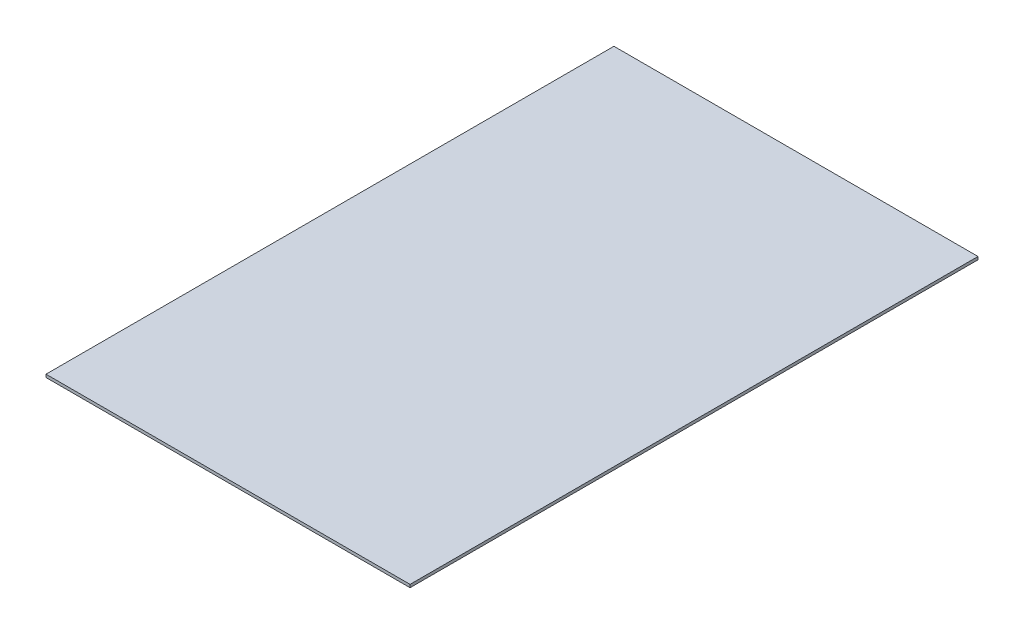
ISO-10303-21;
HEADER;
FILE_DESCRIPTION(('STEP AP214'),'2;1');
FILE_NAME('part.step','',(''),(''),'','','');
FILE_SCHEMA(('AUTOMOTIVE_DESIGN { 1 0 10303 214 1 1 1 1 }'));
ENDSEC;
DATA;
#1=APPLICATION_CONTEXT('core data for automotive mechanical design processes');
#2=APPLICATION_PROTOCOL_DEFINITION('international standard','automotive_design',2000,#1);
#3=PRODUCT_CONTEXT('',#1,'mechanical');
#4=PRODUCT('Part','Part','',(#3));
#5=PRODUCT_RELATED_PRODUCT_CATEGORY('part','',(#4));
#6=PRODUCT_DEFINITION_FORMATION('','',#4);
#7=PRODUCT_DEFINITION_CONTEXT('part definition',#1,'design');
#8=PRODUCT_DEFINITION('design','',#6,#7);
#9=PRODUCT_DEFINITION_SHAPE('','',#8);
#10=(LENGTH_UNIT() NAMED_UNIT(*) SI_UNIT(.MILLI.,.METRE.));
#11=(NAMED_UNIT(*) PLANE_ANGLE_UNIT() SI_UNIT($,.RADIAN.));
#12=(NAMED_UNIT(*) SI_UNIT($,.STERADIAN.) SOLID_ANGLE_UNIT());
#13=UNCERTAINTY_MEASURE_WITH_UNIT(LENGTH_MEASURE(1.E-05),#10,'distance_accuracy_value','');
#14=(GEOMETRIC_REPRESENTATION_CONTEXT(3) GLOBAL_UNCERTAINTY_ASSIGNED_CONTEXT((#13)) GLOBAL_UNIT_ASSIGNED_CONTEXT((#10,
#11,#12)) REPRESENTATION_CONTEXT('',''));
#15=CARTESIAN_POINT('',(0.,0.,0.));
#16=DIRECTION('',(0.,0.,1.));
#17=DIRECTION('',(1.,0.,0.));
#18=AXIS2_PLACEMENT_3D('',#15,#16,#17);
#19=CARTESIAN_POINT('',(158.75,2.54,247.65));
#20=DIRECTION('',(-1.,0.,0.));
#21=DIRECTION('',(0.,0.,1.));
#22=AXIS2_PLACEMENT_3D('',#19,#20,#21);
#23=PLANE('',#22);
#24=DIRECTION('',(0.,0.,-1.));
#25=VECTOR('',#24,1.);
#26=CARTESIAN_POINT('',(158.75,0.,247.65));
#27=LINE('',#26,#25);
#28=CARTESIAN_POINT('',(158.75,0.,247.65));
#29=VERTEX_POINT('',#28);
#30=CARTESIAN_POINT('',(158.75,0.,-247.65));
#31=VERTEX_POINT('',#30);
#32=EDGE_CURVE('E112',#29,#31,#27,.T.);
#33=ORIENTED_EDGE('',*,*,#32,.T.);
#34=DIRECTION('',(0.,-1.,0.));
#35=VECTOR('',#34,1.);
#36=CARTESIAN_POINT('',(158.75,2.54,-247.65));
#37=LINE('',#36,#35);
#38=CARTESIAN_POINT('',(158.75,2.54,-247.65));
#39=VERTEX_POINT('',#38);
#40=EDGE_CURVE('E11',#39,#31,#37,.T.);
#41=ORIENTED_EDGE('',*,*,#40,.F.);
#42=DIRECTION('',(0.,0.,-1.));
#43=VECTOR('',#42,1.);
#44=CARTESIAN_POINT('',(158.75,2.54,247.65));
#45=LINE('',#44,#43);
#46=CARTESIAN_POINT('',(158.75,2.54,247.65));
#47=VERTEX_POINT('',#46);
#48=EDGE_CURVE('E96',#47,#39,#45,.T.);
#49=ORIENTED_EDGE('',*,*,#48,.F.);
#50=DIRECTION('',(0.,-1.,0.));
#51=VECTOR('',#50,1.);
#52=CARTESIAN_POINT('',(158.75,2.54,247.65));
#53=LINE('',#52,#51);
#54=EDGE_CURVE('E108',#47,#29,#53,.T.);
#55=ORIENTED_EDGE('',*,*,#54,.T.);
#56=EDGE_LOOP('',(#33,#41,#49,#55));
#57=FACE_BOUND('',#56,.T.);
#58=ADVANCED_FACE('F44',(#57),#23,.F.);
#59=CARTESIAN_POINT('',(-158.75,2.54,-247.65));
#60=DIRECTION('',(0.,0.,1.));
#61=DIRECTION('',(1.,0.,0.));
#62=AXIS2_PLACEMENT_3D('',#59,#60,#61);
#63=PLANE('',#62);
#64=DIRECTION('',(-1.,0.,0.));
#65=VECTOR('',#64,1.);
#66=CARTESIAN_POINT('',(-158.75,0.,-247.65));
#67=LINE('',#66,#65);
#68=CARTESIAN_POINT('',(-158.75,0.,-247.65));
#69=VERTEX_POINT('',#68);
#70=EDGE_CURVE('E101',#31,#69,#67,.T.);
#71=ORIENTED_EDGE('',*,*,#70,.T.);
#72=DIRECTION('',(0.,-1.,0.));
#73=VECTOR('',#72,1.);
#74=CARTESIAN_POINT('',(-158.75,2.54,-247.65));
#75=LINE('',#74,#73);
#76=CARTESIAN_POINT('',(-158.75,2.54,-247.65));
#77=VERTEX_POINT('',#76);
#78=EDGE_CURVE('E53',#77,#69,#75,.T.);
#79=ORIENTED_EDGE('',*,*,#78,.F.);
#80=DIRECTION('',(-1.,0.,0.));
#81=VECTOR('',#80,1.);
#82=CARTESIAN_POINT('',(-158.75,2.54,-247.65));
#83=LINE('',#82,#81);
#84=EDGE_CURVE('E91',#39,#77,#83,.T.);
#85=ORIENTED_EDGE('',*,*,#84,.F.);
#86=ORIENTED_EDGE('',*,*,#40,.T.);
#87=EDGE_LOOP('',(#71,#79,#85,#86));
#88=FACE_BOUND('',#87,.T.);
#89=ADVANCED_FACE('F100',(#88),#63,.F.);
#90=CARTESIAN_POINT('',(-158.75,2.54,247.65));
#91=DIRECTION('',(1.,0.,0.));
#92=DIRECTION('',(0.,0.,-1.));
#93=AXIS2_PLACEMENT_3D('',#90,#91,#92);
#94=PLANE('',#93);
#95=DIRECTION('',(0.,0.,1.));
#96=VECTOR('',#95,1.);
#97=CARTESIAN_POINT('',(-158.75,0.,247.65));
#98=LINE('',#97,#96);
#99=CARTESIAN_POINT('',(-158.75,0.,247.65));
#100=VERTEX_POINT('',#99);
#101=EDGE_CURVE('E78',#69,#100,#98,.T.);
#102=ORIENTED_EDGE('',*,*,#101,.T.);
#103=DIRECTION('',(0.,-1.,0.));
#104=VECTOR('',#103,1.);
#105=CARTESIAN_POINT('',(-158.75,2.54,247.65));
#106=LINE('',#105,#104);
#107=CARTESIAN_POINT('',(-158.75,2.54,247.65));
#108=VERTEX_POINT('',#107);
#109=EDGE_CURVE('E103',#108,#100,#106,.T.);
#110=ORIENTED_EDGE('',*,*,#109,.F.);
#111=DIRECTION('',(0.,0.,1.));
#112=VECTOR('',#111,1.);
#113=CARTESIAN_POINT('',(-158.75,2.54,247.65));
#114=LINE('',#113,#112);
#115=EDGE_CURVE('E94',#77,#108,#114,.T.);
#116=ORIENTED_EDGE('',*,*,#115,.F.);
#117=ORIENTED_EDGE('',*,*,#78,.T.);
#118=EDGE_LOOP('',(#102,#110,#116,#117));
#119=FACE_BOUND('',#118,.T.);
#120=ADVANCED_FACE('F104',(#119),#94,.F.);
#121=CARTESIAN_POINT('',(-158.75,2.54,247.65));
#122=DIRECTION('',(0.,0.,-1.));
#123=DIRECTION('',(-1.,0.,0.));
#124=AXIS2_PLACEMENT_3D('',#121,#122,#123);
#125=PLANE('',#124);
#126=DIRECTION('',(1.,0.,0.));
#127=VECTOR('',#126,1.);
#128=CARTESIAN_POINT('',(-158.75,0.,247.65));
#129=LINE('',#128,#127);
#130=EDGE_CURVE('E84',#100,#29,#129,.T.);
#131=ORIENTED_EDGE('',*,*,#130,.T.);
#132=ORIENTED_EDGE('',*,*,#54,.F.);
#133=DIRECTION('',(1.,0.,0.));
#134=VECTOR('',#133,1.);
#135=CARTESIAN_POINT('',(-158.75,2.54,247.65));
#136=LINE('',#135,#134);
#137=EDGE_CURVE('E61',#108,#47,#136,.T.);
#138=ORIENTED_EDGE('',*,*,#137,.F.);
#139=ORIENTED_EDGE('',*,*,#109,.T.);
#140=EDGE_LOOP('',(#131,#132,#138,#139));
#141=FACE_BOUND('',#140,.T.);
#142=ADVANCED_FACE('F125',(#141),#125,.F.);
#143=CARTESIAN_POINT('',(0.,2.54,0.));
#144=DIRECTION('',(0.,-1.,0.));
#145=DIRECTION('',(0.,0.,-1.));
#146=AXIS2_PLACEMENT_3D('',#143,#144,#145);
#147=PLANE('',#146);
#148=ORIENTED_EDGE('',*,*,#48,.T.);
#149=ORIENTED_EDGE('',*,*,#84,.T.);
#150=ORIENTED_EDGE('',*,*,#115,.T.);
#151=ORIENTED_EDGE('',*,*,#137,.T.);
#152=EDGE_LOOP('',(#148,#149,#150,#151));
#153=FACE_BOUND('',#152,.T.);
#154=ADVANCED_FACE('F92',(#153),#147,.F.);
#155=CARTESIAN_POINT('',(0.,0.,0.));
#156=DIRECTION('',(0.,-1.,0.));
#157=DIRECTION('',(0.,0.,-1.));
#158=AXIS2_PLACEMENT_3D('',#155,#156,#157);
#159=PLANE('',#158);
#160=ORIENTED_EDGE('',*,*,#32,.F.);
#161=ORIENTED_EDGE('',*,*,#130,.F.);
#162=ORIENTED_EDGE('',*,*,#101,.F.);
#163=ORIENTED_EDGE('',*,*,#70,.F.);
#164=EDGE_LOOP('',(#160,#161,#162,#163));
#165=FACE_BOUND('',#164,.T.);
#166=ADVANCED_FACE('F128',(#165),#159,.T.);
#167=CLOSED_SHELL('',(#58,#89,#120,#142,#154,#166));
#168=MANIFOLD_SOLID_BREP('B2',#167);
#169=ADVANCED_BREP_SHAPE_REPRESENTATION('',(#18,#168),#14);
#170=SHAPE_DEFINITION_REPRESENTATION(#9,#169);
ENDSEC;
END-ISO-10303-21;
